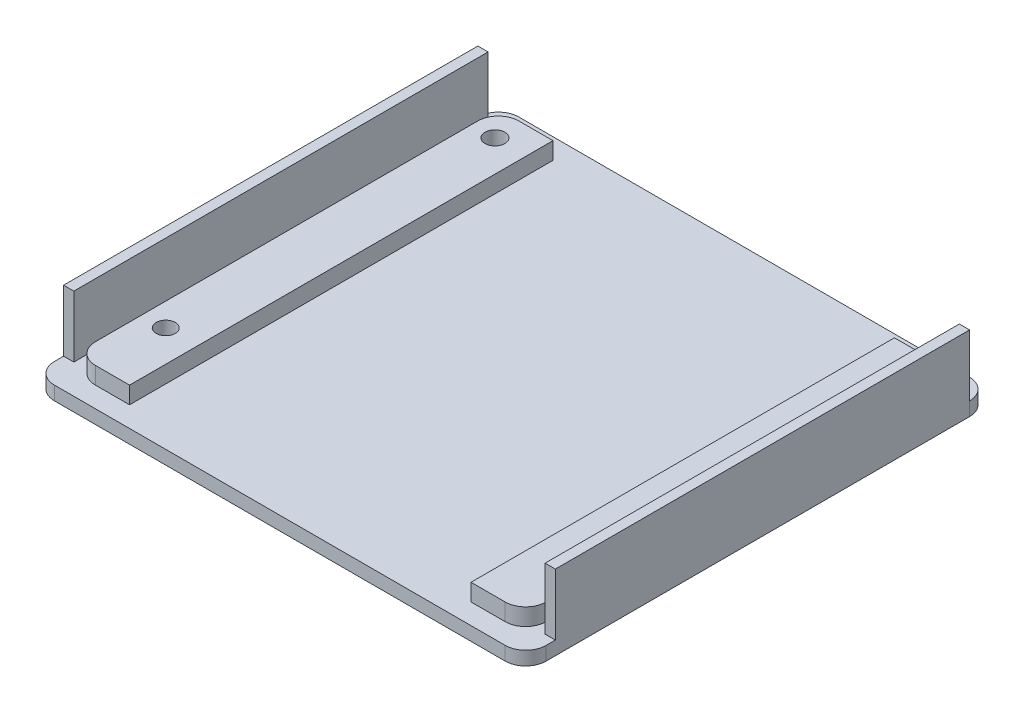
ISO-10303-21;
HEADER;
FILE_DESCRIPTION(('STEP AP214'),'2;1');
FILE_NAME('part.step','',(''),(''),'','','');
FILE_SCHEMA(('AUTOMOTIVE_DESIGN { 1 0 10303 214 1 1 1 1 }'));
ENDSEC;
DATA;
#1=APPLICATION_CONTEXT('core data for automotive mechanical design processes');
#2=APPLICATION_PROTOCOL_DEFINITION('international standard','automotive_design',2000,#1);
#3=PRODUCT_CONTEXT('',#1,'mechanical');
#4=PRODUCT('Part','Part','',(#3));
#5=PRODUCT_RELATED_PRODUCT_CATEGORY('part','',(#4));
#6=PRODUCT_DEFINITION_FORMATION('','',#4);
#7=PRODUCT_DEFINITION_CONTEXT('part definition',#1,'design');
#8=PRODUCT_DEFINITION('design','',#6,#7);
#9=PRODUCT_DEFINITION_SHAPE('','',#8);
#10=(LENGTH_UNIT() NAMED_UNIT(*) SI_UNIT(.MILLI.,.METRE.));
#11=(NAMED_UNIT(*) PLANE_ANGLE_UNIT() SI_UNIT($,.RADIAN.));
#12=(NAMED_UNIT(*) SI_UNIT($,.STERADIAN.) SOLID_ANGLE_UNIT());
#13=UNCERTAINTY_MEASURE_WITH_UNIT(LENGTH_MEASURE(1.E-05),#10,'distance_accuracy_value','');
#14=(GEOMETRIC_REPRESENTATION_CONTEXT(3) GLOBAL_UNCERTAINTY_ASSIGNED_CONTEXT((#13)) GLOBAL_UNIT_ASSIGNED_CONTEXT((#10,
#11,#12)) REPRESENTATION_CONTEXT('',''));
#15=CARTESIAN_POINT('',(0.,0.,0.));
#16=DIRECTION('',(0.,0.,1.));
#17=DIRECTION('',(1.,0.,0.));
#18=AXIS2_PLACEMENT_3D('',#15,#16,#17);
#19=CARTESIAN_POINT('',(-33.,2.,31.));
#20=DIRECTION('',(0.,1.,0.));
#21=DIRECTION('',(0.,0.,1.));
#22=AXIS2_PLACEMENT_3D('',#19,#20,#21);
#23=PLANE('',#22);
#24=DIRECTION('',(0.,0.,-1.));
#25=VECTOR('',#24,1.);
#26=CARTESIAN_POINT('',(33.,2.,-28.));
#27=LINE('',#26,#25);
#28=CARTESIAN_POINT('',(33.,2.,28.));
#29=VERTEX_POINT('',#28);
#30=CARTESIAN_POINT('',(33.,2.,-28.));
#31=VERTEX_POINT('',#30);
#32=EDGE_CURVE('E248',#29,#31,#27,.T.);
#33=ORIENTED_EDGE('',*,*,#32,.F.);
#34=CARTESIAN_POINT('',(30.,2.,28.));
#35=DIRECTION('',(0.,1.,0.));
#36=DIRECTION('',(0.,0.,-1.));
#37=AXIS2_PLACEMENT_3D('',#34,#35,#36);
#38=CIRCLE('',#37,3.);
#39=CARTESIAN_POINT('',(30.,2.,31.));
#40=VERTEX_POINT('',#39);
#41=EDGE_CURVE('E240',#40,#29,#38,.T.);
#42=ORIENTED_EDGE('',*,*,#41,.F.);
#43=DIRECTION('',(1.,0.,0.));
#44=VECTOR('',#43,1.);
#45=CARTESIAN_POINT('',(30.,2.,31.));
#46=LINE('',#45,#44);
#47=CARTESIAN_POINT('',(25.,2.,31.));
#48=VERTEX_POINT('',#47);
#49=EDGE_CURVE('E224',#48,#40,#46,.T.);
#50=ORIENTED_EDGE('',*,*,#49,.F.);
#51=DIRECTION('',(0.,0.,1.));
#52=VECTOR('',#51,1.);
#53=CARTESIAN_POINT('',(25.,2.,-31.));
#54=LINE('',#53,#52);
#55=CARTESIAN_POINT('',(25.,2.,-31.));
#56=VERTEX_POINT('',#55);
#57=EDGE_CURVE('E233',#56,#48,#54,.T.);
#58=ORIENTED_EDGE('',*,*,#57,.F.);
#59=DIRECTION('',(-1.,0.,0.));
#60=VECTOR('',#59,1.);
#61=CARTESIAN_POINT('',(30.,2.,-31.));
#62=LINE('',#61,#60);
#63=CARTESIAN_POINT('',(30.,2.,-31.));
#64=VERTEX_POINT('',#63);
#65=EDGE_CURVE('E1008',#64,#56,#62,.T.);
#66=ORIENTED_EDGE('',*,*,#65,.F.);
#67=CARTESIAN_POINT('',(30.,2.,-28.));
#68=DIRECTION('',(0.,1.,0.));
#69=DIRECTION('',(0.,0.,-1.));
#70=AXIS2_PLACEMENT_3D('',#67,#68,#69);
#71=CIRCLE('',#70,3.);
#72=EDGE_CURVE('E257',#31,#64,#71,.T.);
#73=ORIENTED_EDGE('',*,*,#72,.F.);
#74=EDGE_LOOP('',(#33,#42,#50,#58,#66,#73));
#75=FACE_BOUND('',#74,.T.);
#76=DIRECTION('',(-1.,0.,0.));
#77=VECTOR('',#76,1.);
#78=CARTESIAN_POINT('',(-30.,2.,-31.));
#79=LINE('',#78,#77);
#80=CARTESIAN_POINT('',(-25.,2.,-31.));
#81=VERTEX_POINT('',#80);
#82=CARTESIAN_POINT('',(-30.,2.,-31.));
#83=VERTEX_POINT('',#82);
#84=EDGE_CURVE('E313',#81,#83,#79,.T.);
#85=ORIENTED_EDGE('',*,*,#84,.F.);
#86=DIRECTION('',(0.,0.,-1.));
#87=VECTOR('',#86,1.);
#88=CARTESIAN_POINT('',(-25.,2.,-31.));
#89=LINE('',#88,#87);
#90=CARTESIAN_POINT('',(-25.,2.,31.));
#91=VERTEX_POINT('',#90);
#92=EDGE_CURVE('E288',#91,#81,#89,.T.);
#93=ORIENTED_EDGE('',*,*,#92,.F.);
#94=DIRECTION('',(1.,0.,0.));
#95=VECTOR('',#94,1.);
#96=CARTESIAN_POINT('',(-30.,2.,31.));
#97=LINE('',#96,#95);
#98=CARTESIAN_POINT('',(-30.,2.,31.));
#99=VERTEX_POINT('',#98);
#100=EDGE_CURVE('E294',#99,#91,#97,.T.);
#101=ORIENTED_EDGE('',*,*,#100,.F.);
#102=CARTESIAN_POINT('',(-30.,2.,28.));
#103=DIRECTION('',(0.,1.,0.));
#104=DIRECTION('',(0.,0.,1.));
#105=AXIS2_PLACEMENT_3D('',#102,#103,#104);
#106=CIRCLE('',#105,3.);
#107=CARTESIAN_POINT('',(-33.,2.,28.));
#108=VERTEX_POINT('',#107);
#109=EDGE_CURVE('E322',#108,#99,#106,.T.);
#110=ORIENTED_EDGE('',*,*,#109,.F.);
#111=DIRECTION('',(0.,0.,1.));
#112=VECTOR('',#111,1.);
#113=CARTESIAN_POINT('',(-33.,2.,-28.));
#114=LINE('',#113,#112);
#115=CARTESIAN_POINT('',(-33.,2.,-28.));
#116=VERTEX_POINT('',#115);
#117=EDGE_CURVE('E319',#116,#108,#114,.T.);
#118=ORIENTED_EDGE('',*,*,#117,.F.);
#119=CARTESIAN_POINT('',(-30.,2.,-28.));
#120=DIRECTION('',(0.,1.,0.));
#121=DIRECTION('',(0.,0.,1.));
#122=AXIS2_PLACEMENT_3D('',#119,#120,#121);
#123=CIRCLE('',#122,3.);
#124=EDGE_CURVE('E316',#83,#116,#123,.T.);
#125=ORIENTED_EDGE('',*,*,#124,.F.);
#126=EDGE_LOOP('',(#85,#93,#101,#110,#118,#125));
#127=FACE_BOUND('',#126,.T.);
#128=DIRECTION('',(0.,0.,1.));
#129=VECTOR('',#128,1.);
#130=CARTESIAN_POINT('',(34.5,2.,-31.));
#131=LINE('',#130,#129);
#132=CARTESIAN_POINT('',(34.5,2.,-31.));
#133=VERTEX_POINT('',#132);
#134=CARTESIAN_POINT('',(34.5,2.,29.6598329980831));
#135=VERTEX_POINT('',#134);
#136=EDGE_CURVE('E365',#133,#135,#131,.T.);
#137=ORIENTED_EDGE('',*,*,#136,.F.);
#138=DIRECTION('',(-1.,0.,0.));
#139=VECTOR('',#138,1.);
#140=CARTESIAN_POINT('',(36.,2.,-31.));
#141=LINE('',#140,#139);
#142=CARTESIAN_POINT('',(36.,2.,-31.));
#143=VERTEX_POINT('',#142);
#144=EDGE_CURVE('E370',#143,#133,#141,.T.);
#145=ORIENTED_EDGE('',*,*,#144,.F.);
#146=CARTESIAN_POINT('',(33.,2.,-31.));
#147=DIRECTION('',(0.,1.,0.));
#148=DIRECTION('',(0.,0.,-1.));
#149=AXIS2_PLACEMENT_3D('',#146,#147,#148);
#150=CIRCLE('',#149,3.);
#151=CARTESIAN_POINT('',(33.,2.,-34.));
#152=VERTEX_POINT('',#151);
#153=EDGE_CURVE('E441',#143,#152,#150,.T.);
#154=ORIENTED_EDGE('',*,*,#153,.T.);
#155=DIRECTION('',(-1.,0.,0.));
#156=VECTOR('',#155,1.);
#157=CARTESIAN_POINT('',(-33.,2.,-34.));
#158=LINE('',#157,#156);
#159=CARTESIAN_POINT('',(-33.,2.,-34.));
#160=VERTEX_POINT('',#159);
#161=EDGE_CURVE('E444',#152,#160,#158,.T.);
#162=ORIENTED_EDGE('',*,*,#161,.T.);
#163=CARTESIAN_POINT('',(-33.,2.,-31.));
#164=DIRECTION('',(0.,1.,0.));
#165=DIRECTION('',(0.,0.,1.));
#166=AXIS2_PLACEMENT_3D('',#163,#164,#165);
#167=CIRCLE('',#166,3.00000000000001);
#168=CARTESIAN_POINT('',(-36.,2.,-31.));
#169=VERTEX_POINT('',#168);
#170=EDGE_CURVE('E447',#160,#169,#167,.T.);
#171=ORIENTED_EDGE('',*,*,#170,.T.);
#172=DIRECTION('',(-1.,0.,0.));
#173=VECTOR('',#172,1.);
#174=CARTESIAN_POINT('',(-36.,2.,-31.));
#175=LINE('',#174,#173);
#176=CARTESIAN_POINT('',(-34.5,2.,-31.));
#177=VERTEX_POINT('',#176);
#178=EDGE_CURVE('E390',#177,#169,#175,.T.);
#179=ORIENTED_EDGE('',*,*,#178,.F.);
#180=DIRECTION('',(0.,0.,-1.));
#181=VECTOR('',#180,1.);
#182=CARTESIAN_POINT('',(-34.5,2.,-31.));
#183=LINE('',#182,#181);
#184=CARTESIAN_POINT('',(-34.5,2.,29.6598329980831));
#185=VERTEX_POINT('',#184);
#186=EDGE_CURVE('E403',#185,#177,#183,.T.);
#187=ORIENTED_EDGE('',*,*,#186,.F.);
#188=DIRECTION('',(1.,0.,0.));
#189=VECTOR('',#188,1.);
#190=CARTESIAN_POINT('',(-36.,2.,29.6598329980831));
#191=LINE('',#190,#189);
#192=CARTESIAN_POINT('',(-36.,2.,29.6598329980831));
#193=VERTEX_POINT('',#192);
#194=EDGE_CURVE('E373',#193,#185,#191,.T.);
#195=ORIENTED_EDGE('',*,*,#194,.F.);
#196=DIRECTION('',(0.,0.,1.));
#197=VECTOR('',#196,1.);
#198=CARTESIAN_POINT('',(-36.,2.,-31.));
#199=LINE('',#198,#197);
#200=CARTESIAN_POINT('',(-36.,2.,31.));
#201=VERTEX_POINT('',#200);
#202=EDGE_CURVE('E450',#193,#201,#199,.T.);
#203=ORIENTED_EDGE('',*,*,#202,.T.);
#204=CARTESIAN_POINT('',(-33.,2.,31.));
#205=DIRECTION('',(0.,1.,0.));
#206=DIRECTION('',(0.,0.,1.));
#207=AXIS2_PLACEMENT_3D('',#204,#205,#206);
#208=CIRCLE('',#207,2.99999999999999);
#209=CARTESIAN_POINT('',(-33.,2.,34.));
#210=VERTEX_POINT('',#209);
#211=EDGE_CURVE('E426',#201,#210,#208,.T.);
#212=ORIENTED_EDGE('',*,*,#211,.T.);
#213=DIRECTION('',(1.,0.,0.));
#214=VECTOR('',#213,1.);
#215=CARTESIAN_POINT('',(-33.,2.,34.));
#216=LINE('',#215,#214);
#217=CARTESIAN_POINT('',(33.,2.,34.));
#218=VERTEX_POINT('',#217);
#219=EDGE_CURVE('E430',#210,#218,#216,.T.);
#220=ORIENTED_EDGE('',*,*,#219,.T.);
#221=CARTESIAN_POINT('',(33.,2.,31.));
#222=DIRECTION('',(0.,1.,0.));
#223=DIRECTION('',(0.,0.,1.));
#224=AXIS2_PLACEMENT_3D('',#221,#222,#223);
#225=CIRCLE('',#224,3.);
#226=CARTESIAN_POINT('',(36.,2.,31.));
#227=VERTEX_POINT('',#226);
#228=EDGE_CURVE('E434',#218,#227,#225,.T.);
#229=ORIENTED_EDGE('',*,*,#228,.T.);
#230=DIRECTION('',(0.,0.,-1.));
#231=VECTOR('',#230,1.);
#232=CARTESIAN_POINT('',(36.,2.,-31.));
#233=LINE('',#232,#231);
#234=CARTESIAN_POINT('',(36.,2.,29.6598329980831));
#235=VERTEX_POINT('',#234);
#236=EDGE_CURVE('E437',#227,#235,#233,.T.);
#237=ORIENTED_EDGE('',*,*,#236,.T.);
#238=DIRECTION('',(1.,0.,0.));
#239=VECTOR('',#238,1.);
#240=CARTESIAN_POINT('',(36.,2.,29.6598329980831));
#241=LINE('',#240,#239);
#242=EDGE_CURVE('E362',#135,#235,#241,.T.);
#243=ORIENTED_EDGE('',*,*,#242,.F.);
#244=EDGE_LOOP('',(#137,#145,#154,#162,#171,#179,#187,#195,#203,#212,#220,#229,#237,#243));
#245=FACE_BOUND('',#244,.T.);
#246=ADVANCED_FACE('F43',(#75,#127,#245),#23,.T.);
#247=CARTESIAN_POINT('',(-33.,2.,31.));
#248=DIRECTION('',(0.,-1.,0.));
#249=DIRECTION('',(0.,0.,-1.));
#250=AXIS2_PLACEMENT_3D('',#247,#248,#249);
#251=CYLINDRICAL_SURFACE('',#250,2.99999999999999);
#252=CARTESIAN_POINT('',(-33.,0.,31.));
#253=DIRECTION('',(0.,1.,0.));
#254=DIRECTION('',(0.,0.,1.));
#255=AXIS2_PLACEMENT_3D('',#252,#253,#254);
#256=CIRCLE('',#255,2.99999999999999);
#257=CARTESIAN_POINT('',(-36.,0.,31.));
#258=VERTEX_POINT('',#257);
#259=CARTESIAN_POINT('',(-33.,0.,34.));
#260=VERTEX_POINT('',#259);
#261=EDGE_CURVE('E425',#258,#260,#256,.T.);
#262=ORIENTED_EDGE('',*,*,#261,.T.);
#263=DIRECTION('',(0.,-1.,0.));
#264=VECTOR('',#263,1.);
#265=CARTESIAN_POINT('',(-33.,2.,34.));
#266=LINE('',#265,#264);
#267=EDGE_CURVE('E504',#210,#260,#266,.T.);
#268=ORIENTED_EDGE('',*,*,#267,.F.);
#269=ORIENTED_EDGE('',*,*,#211,.F.);
#270=DIRECTION('',(0.,-1.,0.));
#271=VECTOR('',#270,1.);
#272=CARTESIAN_POINT('',(-36.,2.,31.));
#273=LINE('',#272,#271);
#274=EDGE_CURVE('E453',#201,#258,#273,.T.);
#275=ORIENTED_EDGE('',*,*,#274,.T.);
#276=EDGE_LOOP('',(#262,#268,#269,#275));
#277=FACE_BOUND('',#276,.T.);
#278=ADVANCED_FACE('F45',(#277),#251,.T.);
#279=CARTESIAN_POINT('',(-33.,2.,34.));
#280=DIRECTION('',(0.,0.,-1.));
#281=DIRECTION('',(-1.,0.,0.));
#282=AXIS2_PLACEMENT_3D('',#279,#280,#281);
#283=PLANE('',#282);
#284=DIRECTION('',(1.,0.,0.));
#285=VECTOR('',#284,1.);
#286=CARTESIAN_POINT('',(-33.,0.,34.));
#287=LINE('',#286,#285);
#288=CARTESIAN_POINT('',(33.,0.,34.));
#289=VERTEX_POINT('',#288);
#290=EDGE_CURVE('E457',#260,#289,#287,.T.);
#291=ORIENTED_EDGE('',*,*,#290,.T.);
#292=DIRECTION('',(0.,-1.,0.));
#293=VECTOR('',#292,1.);
#294=CARTESIAN_POINT('',(33.,2.,34.));
#295=LINE('',#294,#293);
#296=EDGE_CURVE('E500',#218,#289,#295,.T.);
#297=ORIENTED_EDGE('',*,*,#296,.F.);
#298=ORIENTED_EDGE('',*,*,#219,.F.);
#299=ORIENTED_EDGE('',*,*,#267,.T.);
#300=EDGE_LOOP('',(#291,#297,#298,#299));
#301=FACE_BOUND('',#300,.T.);
#302=ADVANCED_FACE('F544',(#301),#283,.F.);
#303=CARTESIAN_POINT('',(33.,2.,31.));
#304=DIRECTION('',(0.,-1.,0.));
#305=DIRECTION('',(0.,0.,-1.));
#306=AXIS2_PLACEMENT_3D('',#303,#304,#305);
#307=CYLINDRICAL_SURFACE('',#306,3.);
#308=CARTESIAN_POINT('',(33.,0.,31.));
#309=DIRECTION('',(0.,1.,0.));
#310=DIRECTION('',(0.,0.,1.));
#311=AXIS2_PLACEMENT_3D('',#308,#309,#310);
#312=CIRCLE('',#311,3.);
#313=CARTESIAN_POINT('',(36.,0.,31.));
#314=VERTEX_POINT('',#313);
#315=EDGE_CURVE('E460',#289,#314,#312,.T.);
#316=ORIENTED_EDGE('',*,*,#315,.T.);
#317=DIRECTION('',(0.,-1.,0.));
#318=VECTOR('',#317,1.);
#319=CARTESIAN_POINT('',(36.,2.,31.));
#320=LINE('',#319,#318);
#321=EDGE_CURVE('E496',#227,#314,#320,.T.);
#322=ORIENTED_EDGE('',*,*,#321,.F.);
#323=ORIENTED_EDGE('',*,*,#228,.F.);
#324=ORIENTED_EDGE('',*,*,#296,.T.);
#325=EDGE_LOOP('',(#316,#322,#323,#324));
#326=FACE_BOUND('',#325,.T.);
#327=ADVANCED_FACE('F648',(#326),#307,.T.);
#328=CARTESIAN_POINT('',(36.,2.,-31.));
#329=DIRECTION('',(-1.,0.,0.));
#330=DIRECTION('',(0.,0.,1.));
#331=AXIS2_PLACEMENT_3D('',#328,#329,#330);
#332=PLANE('',#331);
#333=DIRECTION('',(0.,0.,-1.));
#334=VECTOR('',#333,1.);
#335=CARTESIAN_POINT('',(36.,0.,-31.));
#336=LINE('',#335,#334);
#337=CARTESIAN_POINT('',(36.,0.,-31.));
#338=VERTEX_POINT('',#337);
#339=EDGE_CURVE('E463',#314,#338,#336,.T.);
#340=ORIENTED_EDGE('',*,*,#339,.T.);
#341=DIRECTION('',(0.,-1.,0.));
#342=VECTOR('',#341,1.);
#343=CARTESIAN_POINT('',(36.,2.,-31.));
#344=LINE('',#343,#342);
#345=EDGE_CURVE('E492',#143,#338,#344,.T.);
#346=ORIENTED_EDGE('',*,*,#345,.F.);
#347=DIRECTION('',(0.,-1.,0.));
#348=VECTOR('',#347,1.);
#349=CARTESIAN_POINT('',(36.,11.,-31.));
#350=LINE('',#349,#348);
#351=CARTESIAN_POINT('',(36.,11.,-31.));
#352=VERTEX_POINT('',#351);
#353=EDGE_CURVE('E347',#352,#143,#350,.T.);
#354=ORIENTED_EDGE('',*,*,#353,.F.);
#355=DIRECTION('',(0.,0.,-1.));
#356=VECTOR('',#355,1.);
#357=CARTESIAN_POINT('',(36.,11.,-31.));
#358=LINE('',#357,#356);
#359=CARTESIAN_POINT('',(36.,11.,29.6598329980831));
#360=VERTEX_POINT('',#359);
#361=EDGE_CURVE('E366',#360,#352,#358,.T.);
#362=ORIENTED_EDGE('',*,*,#361,.F.);
#363=DIRECTION('',(0.,-1.,0.));
#364=VECTOR('',#363,1.);
#365=CARTESIAN_POINT('',(36.,11.,29.6598329980831));
#366=LINE('',#365,#364);
#367=EDGE_CURVE('E357',#360,#235,#366,.T.);
#368=ORIENTED_EDGE('',*,*,#367,.T.);
#369=ORIENTED_EDGE('',*,*,#236,.F.);
#370=ORIENTED_EDGE('',*,*,#321,.T.);
#371=EDGE_LOOP('',(#340,#346,#354,#362,#368,#369,#370));
#372=FACE_BOUND('',#371,.T.);
#373=ADVANCED_FACE('F652',(#372),#332,.F.);
#374=CARTESIAN_POINT('',(33.,2.,-31.));
#375=DIRECTION('',(0.,-1.,0.));
#376=DIRECTION('',(0.,0.,-1.));
#377=AXIS2_PLACEMENT_3D('',#374,#375,#376);
#378=CYLINDRICAL_SURFACE('',#377,3.);
#379=CARTESIAN_POINT('',(33.,0.,-31.));
#380=DIRECTION('',(0.,1.,0.));
#381=DIRECTION('',(0.,0.,-1.));
#382=AXIS2_PLACEMENT_3D('',#379,#380,#381);
#383=CIRCLE('',#382,3.);
#384=CARTESIAN_POINT('',(33.,0.,-34.));
#385=VERTEX_POINT('',#384);
#386=EDGE_CURVE('E466',#338,#385,#383,.T.);
#387=ORIENTED_EDGE('',*,*,#386,.T.);
#388=DIRECTION('',(0.,-1.,0.));
#389=VECTOR('',#388,1.);
#390=CARTESIAN_POINT('',(33.,2.,-34.));
#391=LINE('',#390,#389);
#392=EDGE_CURVE('E488',#152,#385,#391,.T.);
#393=ORIENTED_EDGE('',*,*,#392,.F.);
#394=ORIENTED_EDGE('',*,*,#153,.F.);
#395=ORIENTED_EDGE('',*,*,#345,.T.);
#396=EDGE_LOOP('',(#387,#393,#394,#395));
#397=FACE_BOUND('',#396,.T.);
#398=ADVANCED_FACE('F667',(#397),#378,.T.);
#399=CARTESIAN_POINT('',(-33.,2.,-34.));
#400=DIRECTION('',(0.,0.,1.));
#401=DIRECTION('',(1.,0.,0.));
#402=AXIS2_PLACEMENT_3D('',#399,#400,#401);
#403=PLANE('',#402);
#404=DIRECTION('',(-1.,0.,0.));
#405=VECTOR('',#404,1.);
#406=CARTESIAN_POINT('',(-33.,0.,-34.));
#407=LINE('',#406,#405);
#408=CARTESIAN_POINT('',(-33.,0.,-34.));
#409=VERTEX_POINT('',#408);
#410=EDGE_CURVE('E469',#385,#409,#407,.T.);
#411=ORIENTED_EDGE('',*,*,#410,.T.);
#412=DIRECTION('',(0.,-1.,0.));
#413=VECTOR('',#412,1.);
#414=CARTESIAN_POINT('',(-33.,2.,-34.));
#415=LINE('',#414,#413);
#416=EDGE_CURVE('E484',#160,#409,#415,.T.);
#417=ORIENTED_EDGE('',*,*,#416,.F.);
#418=ORIENTED_EDGE('',*,*,#161,.F.);
#419=ORIENTED_EDGE('',*,*,#392,.T.);
#420=EDGE_LOOP('',(#411,#417,#418,#419));
#421=FACE_BOUND('',#420,.T.);
#422=ADVANCED_FACE('F672',(#421),#403,.F.);
#423=CARTESIAN_POINT('',(-33.,2.,-31.));
#424=DIRECTION('',(0.,-1.,0.));
#425=DIRECTION('',(0.,0.,-1.));
#426=AXIS2_PLACEMENT_3D('',#423,#424,#425);
#427=CYLINDRICAL_SURFACE('',#426,3.00000000000001);
#428=CARTESIAN_POINT('',(-33.,0.,-31.));
#429=DIRECTION('',(0.,1.,0.));
#430=DIRECTION('',(0.,0.,1.));
#431=AXIS2_PLACEMENT_3D('',#428,#429,#430);
#432=CIRCLE('',#431,3.00000000000001);
#433=CARTESIAN_POINT('',(-36.,0.,-31.));
#434=VERTEX_POINT('',#433);
#435=EDGE_CURVE('E472',#409,#434,#432,.T.);
#436=ORIENTED_EDGE('',*,*,#435,.T.);
#437=DIRECTION('',(0.,-1.,0.));
#438=VECTOR('',#437,1.);
#439=CARTESIAN_POINT('',(-36.,2.,-31.));
#440=LINE('',#439,#438);
#441=EDGE_CURVE('E480',#169,#434,#440,.T.);
#442=ORIENTED_EDGE('',*,*,#441,.F.);
#443=ORIENTED_EDGE('',*,*,#170,.F.);
#444=ORIENTED_EDGE('',*,*,#416,.T.);
#445=EDGE_LOOP('',(#436,#442,#443,#444));
#446=FACE_BOUND('',#445,.T.);
#447=ADVANCED_FACE('F676',(#446),#427,.T.);
#448=CARTESIAN_POINT('',(-36.,2.,-31.));
#449=DIRECTION('',(1.,0.,0.));
#450=DIRECTION('',(0.,0.,-1.));
#451=AXIS2_PLACEMENT_3D('',#448,#449,#450);
#452=PLANE('',#451);
#453=DIRECTION('',(0.,0.,1.));
#454=VECTOR('',#453,1.);
#455=CARTESIAN_POINT('',(-36.,0.,-31.));
#456=LINE('',#455,#454);
#457=EDGE_CURVE('E431',#434,#258,#456,.T.);
#458=ORIENTED_EDGE('',*,*,#457,.T.);
#459=ORIENTED_EDGE('',*,*,#274,.F.);
#460=ORIENTED_EDGE('',*,*,#202,.F.);
#461=DIRECTION('',(0.,-1.,0.));
#462=VECTOR('',#461,1.);
#463=CARTESIAN_POINT('',(-36.,11.,29.6598329980831));
#464=LINE('',#463,#462);
#465=CARTESIAN_POINT('',(-36.,11.,29.6598329980831));
#466=VERTEX_POINT('',#465);
#467=EDGE_CURVE('E421',#466,#193,#464,.T.);
#468=ORIENTED_EDGE('',*,*,#467,.F.);
#469=DIRECTION('',(0.,0.,1.));
#470=VECTOR('',#469,1.);
#471=CARTESIAN_POINT('',(-36.,11.,-31.));
#472=LINE('',#471,#470);
#473=CARTESIAN_POINT('',(-36.,11.,-31.));
#474=VERTEX_POINT('',#473);
#475=EDGE_CURVE('E385',#474,#466,#472,.T.);
#476=ORIENTED_EDGE('',*,*,#475,.F.);
#477=DIRECTION('',(0.,-1.,0.));
#478=VECTOR('',#477,1.);
#479=CARTESIAN_POINT('',(-36.,11.,-31.));
#480=LINE('',#479,#478);
#481=EDGE_CURVE('E399',#474,#169,#480,.T.);
#482=ORIENTED_EDGE('',*,*,#481,.T.);
#483=ORIENTED_EDGE('',*,*,#441,.T.);
#484=EDGE_LOOP('',(#458,#459,#460,#468,#476,#482,#483));
#485=FACE_BOUND('',#484,.T.);
#486=ADVANCED_FACE('F625',(#485),#452,.F.);
#487=CARTESIAN_POINT('',(-33.,0.,31.));
#488=DIRECTION('',(0.,1.,0.));
#489=DIRECTION('',(0.,0.,1.));
#490=AXIS2_PLACEMENT_3D('',#487,#488,#489);
#491=PLANE('',#490);
#492=ORIENTED_EDGE('',*,*,#261,.F.);
#493=ORIENTED_EDGE('',*,*,#457,.F.);
#494=ORIENTED_EDGE('',*,*,#435,.F.);
#495=ORIENTED_EDGE('',*,*,#410,.F.);
#496=ORIENTED_EDGE('',*,*,#386,.F.);
#497=ORIENTED_EDGE('',*,*,#339,.F.);
#498=ORIENTED_EDGE('',*,*,#315,.F.);
#499=ORIENTED_EDGE('',*,*,#290,.F.);
#500=EDGE_LOOP('',(#492,#493,#494,#495,#496,#497,#498,#499));
#501=FACE_BOUND('',#500,.T.);
#502=ADVANCED_FACE('F620',(#501),#491,.F.);
#503=CARTESIAN_POINT('',(-36.,11.,29.6598329980831));
#504=DIRECTION('',(0.,0.,-1.));
#505=DIRECTION('',(-1.,0.,0.));
#506=AXIS2_PLACEMENT_3D('',#503,#504,#505);
#507=PLANE('',#506);
#508=ORIENTED_EDGE('',*,*,#194,.T.);
#509=DIRECTION('',(0.,-1.,0.));
#510=VECTOR('',#509,1.);
#511=CARTESIAN_POINT('',(-34.5,11.,29.6598329980831));
#512=LINE('',#511,#510);
#513=CARTESIAN_POINT('',(-34.5,11.,29.6598329980831));
#514=VERTEX_POINT('',#513);
#515=EDGE_CURVE('E417',#514,#185,#512,.T.);
#516=ORIENTED_EDGE('',*,*,#515,.F.);
#517=DIRECTION('',(1.,0.,0.));
#518=VECTOR('',#517,1.);
#519=CARTESIAN_POINT('',(-36.,11.,29.6598329980831));
#520=LINE('',#519,#518);
#521=EDGE_CURVE('E389',#466,#514,#520,.T.);
#522=ORIENTED_EDGE('',*,*,#521,.F.);
#523=ORIENTED_EDGE('',*,*,#467,.T.);
#524=EDGE_LOOP('',(#508,#516,#522,#523));
#525=FACE_BOUND('',#524,.T.);
#526=ADVANCED_FACE('F617',(#525),#507,.F.);
#527=CARTESIAN_POINT('',(-34.5,11.,-31.));
#528=DIRECTION('',(-1.,0.,0.));
#529=DIRECTION('',(0.,0.,1.));
#530=AXIS2_PLACEMENT_3D('',#527,#528,#529);
#531=PLANE('',#530);
#532=ORIENTED_EDGE('',*,*,#186,.T.);
#533=DIRECTION('',(0.,-1.,0.));
#534=VECTOR('',#533,1.);
#535=CARTESIAN_POINT('',(-34.5,11.,-31.));
#536=LINE('',#535,#534);
#537=CARTESIAN_POINT('',(-34.5,11.,-31.));
#538=VERTEX_POINT('',#537);
#539=EDGE_CURVE('E413',#538,#177,#536,.T.);
#540=ORIENTED_EDGE('',*,*,#539,.F.);
#541=DIRECTION('',(0.,0.,-1.));
#542=VECTOR('',#541,1.);
#543=CARTESIAN_POINT('',(-34.5,11.,-31.));
#544=LINE('',#543,#542);
#545=EDGE_CURVE('E393',#514,#538,#544,.T.);
#546=ORIENTED_EDGE('',*,*,#545,.F.);
#547=ORIENTED_EDGE('',*,*,#515,.T.);
#548=EDGE_LOOP('',(#532,#540,#546,#547));
#549=FACE_BOUND('',#548,.T.);
#550=ADVANCED_FACE('F614',(#549),#531,.F.);
#551=CARTESIAN_POINT('',(-36.,11.,-31.));
#552=DIRECTION('',(0.,0.,1.));
#553=DIRECTION('',(1.,0.,0.));
#554=AXIS2_PLACEMENT_3D('',#551,#552,#553);
#555=PLANE('',#554);
#556=ORIENTED_EDGE('',*,*,#178,.T.);
#557=ORIENTED_EDGE('',*,*,#481,.F.);
#558=DIRECTION('',(-1.,0.,0.));
#559=VECTOR('',#558,1.);
#560=CARTESIAN_POINT('',(-36.,11.,-31.));
#561=LINE('',#560,#559);
#562=EDGE_CURVE('E396',#538,#474,#561,.T.);
#563=ORIENTED_EDGE('',*,*,#562,.F.);
#564=ORIENTED_EDGE('',*,*,#539,.T.);
#565=EDGE_LOOP('',(#556,#557,#563,#564));
#566=FACE_BOUND('',#565,.T.);
#567=ADVANCED_FACE('F610',(#566),#555,.F.);
#568=CARTESIAN_POINT('',(0.,11.,0.));
#569=DIRECTION('',(0.,1.,0.));
#570=DIRECTION('',(0.,0.,1.));
#571=AXIS2_PLACEMENT_3D('',#568,#569,#570);
#572=PLANE('',#571);
#573=ORIENTED_EDGE('',*,*,#475,.T.);
#574=ORIENTED_EDGE('',*,*,#521,.T.);
#575=ORIENTED_EDGE('',*,*,#545,.T.);
#576=ORIENTED_EDGE('',*,*,#562,.T.);
#577=EDGE_LOOP('',(#573,#574,#575,#576));
#578=FACE_BOUND('',#577,.T.);
#579=ADVANCED_FACE('F596',(#578),#572,.T.);
#580=CARTESIAN_POINT('',(36.,11.,-31.));
#581=DIRECTION('',(0.,0.,1.));
#582=DIRECTION('',(1.,0.,0.));
#583=AXIS2_PLACEMENT_3D('',#580,#581,#582);
#584=PLANE('',#583);
#585=ORIENTED_EDGE('',*,*,#144,.T.);
#586=DIRECTION('',(0.,-1.,0.));
#587=VECTOR('',#586,1.);
#588=CARTESIAN_POINT('',(34.5,11.,-31.));
#589=LINE('',#588,#587);
#590=CARTESIAN_POINT('',(34.5,11.,-31.));
#591=VERTEX_POINT('',#590);
#592=EDGE_CURVE('E350',#591,#133,#589,.T.);
#593=ORIENTED_EDGE('',*,*,#592,.F.);
#594=DIRECTION('',(-1.,0.,0.));
#595=VECTOR('',#594,1.);
#596=CARTESIAN_POINT('',(36.,11.,-31.));
#597=LINE('',#596,#595);
#598=EDGE_CURVE('E379',#352,#591,#597,.T.);
#599=ORIENTED_EDGE('',*,*,#598,.F.);
#600=ORIENTED_EDGE('',*,*,#353,.T.);
#601=EDGE_LOOP('',(#585,#593,#599,#600));
#602=FACE_BOUND('',#601,.T.);
#603=ADVANCED_FACE('F592',(#602),#584,.F.);
#604=CARTESIAN_POINT('',(34.5,11.,-31.));
#605=DIRECTION('',(1.,0.,0.));
#606=DIRECTION('',(0.,0.,-1.));
#607=AXIS2_PLACEMENT_3D('',#604,#605,#606);
#608=PLANE('',#607);
#609=ORIENTED_EDGE('',*,*,#136,.T.);
#610=DIRECTION('',(0.,-1.,0.));
#611=VECTOR('',#610,1.);
#612=CARTESIAN_POINT('',(34.5,11.,29.6598329980831));
#613=LINE('',#612,#611);
#614=CARTESIAN_POINT('',(34.5,11.,29.6598329980831));
#615=VERTEX_POINT('',#614);
#616=EDGE_CURVE('E354',#615,#135,#613,.T.);
#617=ORIENTED_EDGE('',*,*,#616,.F.);
#618=DIRECTION('',(0.,0.,1.));
#619=VECTOR('',#618,1.);
#620=CARTESIAN_POINT('',(34.5,11.,-31.));
#621=LINE('',#620,#619);
#622=EDGE_CURVE('E376',#591,#615,#621,.T.);
#623=ORIENTED_EDGE('',*,*,#622,.F.);
#624=ORIENTED_EDGE('',*,*,#592,.T.);
#625=EDGE_LOOP('',(#609,#617,#623,#624));
#626=FACE_BOUND('',#625,.T.);
#627=ADVANCED_FACE('F595',(#626),#608,.F.);
#628=CARTESIAN_POINT('',(36.,11.,29.6598329980831));
#629=DIRECTION('',(0.,0.,-1.));
#630=DIRECTION('',(-1.,0.,0.));
#631=AXIS2_PLACEMENT_3D('',#628,#629,#630);
#632=PLANE('',#631);
#633=ORIENTED_EDGE('',*,*,#242,.T.);
#634=ORIENTED_EDGE('',*,*,#367,.F.);
#635=DIRECTION('',(1.,0.,0.));
#636=VECTOR('',#635,1.);
#637=CARTESIAN_POINT('',(36.,11.,29.6598329980831));
#638=LINE('',#637,#636);
#639=EDGE_CURVE('E361',#615,#360,#638,.T.);
#640=ORIENTED_EDGE('',*,*,#639,.F.);
#641=ORIENTED_EDGE('',*,*,#616,.T.);
#642=EDGE_LOOP('',(#633,#634,#640,#641));
#643=FACE_BOUND('',#642,.T.);
#644=ADVANCED_FACE('F600',(#643),#632,.F.);
#645=CARTESIAN_POINT('',(0.,11.,0.));
#646=DIRECTION('',(0.,-1.,0.));
#647=DIRECTION('',(0.,0.,-1.));
#648=AXIS2_PLACEMENT_3D('',#645,#646,#647);
#649=PLANE('',#648);
#650=ORIENTED_EDGE('',*,*,#361,.T.);
#651=ORIENTED_EDGE('',*,*,#598,.T.);
#652=ORIENTED_EDGE('',*,*,#622,.T.);
#653=ORIENTED_EDGE('',*,*,#639,.T.);
#654=EDGE_LOOP('',(#650,#651,#652,#653));
#655=FACE_BOUND('',#654,.T.);
#656=ADVANCED_FACE('F569',(#655),#649,.F.);
#657=CARTESIAN_POINT('',(-30.,4.5,28.));
#658=DIRECTION('',(0.,1.,0.));
#659=DIRECTION('',(0.,0.,1.));
#660=AXIS2_PLACEMENT_3D('',#657,#658,#659);
#661=PLANE('',#660);
#662=CARTESIAN_POINT('',(-29.6,4.5,-27.1));
#663=DIRECTION('',(0.,1.,0.));
#664=DIRECTION('',(0.,0.,1.));
#665=AXIS2_PLACEMENT_3D('',#662,#663,#664);
#666=CIRCLE('',#665,1.45);
#667=CARTESIAN_POINT('',(-29.6,4.5,-25.65));
#668=VERTEX_POINT('',#667);
#669=EDGE_CURVE('E284',#668,#668,#666,.T.);
#670=ORIENTED_EDGE('',*,*,#669,.F.);
#671=EDGE_LOOP('',(#670));
#672=FACE_BOUND('',#671,.T.);
#673=DIRECTION('',(0.,0.,-1.));
#674=VECTOR('',#673,1.);
#675=CARTESIAN_POINT('',(-25.,4.5,-31.));
#676=LINE('',#675,#674);
#677=CARTESIAN_POINT('',(-25.,4.5,31.));
#678=VERTEX_POINT('',#677);
#679=CARTESIAN_POINT('',(-25.,4.5,-31.));
#680=VERTEX_POINT('',#679);
#681=EDGE_CURVE('E289',#678,#680,#676,.T.);
#682=ORIENTED_EDGE('',*,*,#681,.T.);
#683=DIRECTION('',(-1.,0.,0.));
#684=VECTOR('',#683,1.);
#685=CARTESIAN_POINT('',(-30.,4.5,-31.));
#686=LINE('',#685,#684);
#687=CARTESIAN_POINT('',(-30.,4.5,-31.));
#688=VERTEX_POINT('',#687);
#689=EDGE_CURVE('E293',#680,#688,#686,.T.);
#690=ORIENTED_EDGE('',*,*,#689,.T.);
#691=CARTESIAN_POINT('',(-30.,4.5,-28.));
#692=DIRECTION('',(0.,1.,0.));
#693=DIRECTION('',(0.,0.,1.));
#694=AXIS2_PLACEMENT_3D('',#691,#692,#693);
#695=CIRCLE('',#694,3.);
#696=CARTESIAN_POINT('',(-33.,4.5,-28.));
#697=VERTEX_POINT('',#696);
#698=EDGE_CURVE('E297',#688,#697,#695,.T.);
#699=ORIENTED_EDGE('',*,*,#698,.T.);
#700=DIRECTION('',(0.,0.,1.));
#701=VECTOR('',#700,1.);
#702=CARTESIAN_POINT('',(-33.,4.5,-28.));
#703=LINE('',#702,#701);
#704=CARTESIAN_POINT('',(-33.,4.5,28.));
#705=VERTEX_POINT('',#704);
#706=EDGE_CURVE('E300',#697,#705,#703,.T.);
#707=ORIENTED_EDGE('',*,*,#706,.T.);
#708=CARTESIAN_POINT('',(-30.,4.5,28.));
#709=DIRECTION('',(0.,1.,0.));
#710=DIRECTION('',(0.,0.,1.));
#711=AXIS2_PLACEMENT_3D('',#708,#709,#710);
#712=CIRCLE('',#711,3.);
#713=CARTESIAN_POINT('',(-30.,4.5,31.));
#714=VERTEX_POINT('',#713);
#715=EDGE_CURVE('E303',#705,#714,#712,.T.);
#716=ORIENTED_EDGE('',*,*,#715,.T.);
#717=DIRECTION('',(1.,0.,0.));
#718=VECTOR('',#717,1.);
#719=CARTESIAN_POINT('',(-30.,4.5,31.));
#720=LINE('',#719,#718);
#721=EDGE_CURVE('E306',#714,#678,#720,.T.);
#722=ORIENTED_EDGE('',*,*,#721,.T.);
#723=EDGE_LOOP('',(#682,#690,#699,#707,#716,#722));
#724=FACE_BOUND('',#723,.T.);
#725=CARTESIAN_POINT('',(-29.6,4.5,21.1));
#726=DIRECTION('',(0.,1.,0.));
#727=DIRECTION('',(0.,0.,1.));
#728=AXIS2_PLACEMENT_3D('',#725,#726,#727);
#729=CIRCLE('',#728,1.4);
#730=CARTESIAN_POINT('',(-29.6,4.5,22.5));
#731=VERTEX_POINT('',#730);
#732=EDGE_CURVE('E280',#731,#731,#729,.T.);
#733=ORIENTED_EDGE('',*,*,#732,.F.);
#734=EDGE_LOOP('',(#733));
#735=FACE_BOUND('',#734,.T.);
#736=ADVANCED_FACE('F565',(#672,#724,#735),#661,.T.);
#737=CARTESIAN_POINT('',(-25.,4.5,-31.));
#738=DIRECTION('',(-1.,0.,0.));
#739=DIRECTION('',(0.,0.,1.));
#740=AXIS2_PLACEMENT_3D('',#737,#738,#739);
#741=PLANE('',#740);
#742=ORIENTED_EDGE('',*,*,#92,.T.);
#743=DIRECTION('',(0.,-1.,0.));
#744=VECTOR('',#743,1.);
#745=CARTESIAN_POINT('',(-25.,4.5,-31.));
#746=LINE('',#745,#744);
#747=EDGE_CURVE('E344',#680,#81,#746,.T.);
#748=ORIENTED_EDGE('',*,*,#747,.F.);
#749=ORIENTED_EDGE('',*,*,#681,.F.);
#750=DIRECTION('',(0.,-1.,0.));
#751=VECTOR('',#750,1.);
#752=CARTESIAN_POINT('',(-25.,4.5,31.));
#753=LINE('',#752,#751);
#754=EDGE_CURVE('E309',#678,#91,#753,.T.);
#755=ORIENTED_EDGE('',*,*,#754,.T.);
#756=EDGE_LOOP('',(#742,#748,#749,#755));
#757=FACE_BOUND('',#756,.T.);
#758=ADVANCED_FACE('F568',(#757),#741,.F.);
#759=CARTESIAN_POINT('',(-30.,4.5,-31.));
#760=DIRECTION('',(0.,0.,1.));
#761=DIRECTION('',(1.,0.,0.));
#762=AXIS2_PLACEMENT_3D('',#759,#760,#761);
#763=PLANE('',#762);
#764=ORIENTED_EDGE('',*,*,#84,.T.);
#765=DIRECTION('',(0.,-1.,0.));
#766=VECTOR('',#765,1.);
#767=CARTESIAN_POINT('',(-30.,4.5,-31.));
#768=LINE('',#767,#766);
#769=EDGE_CURVE('E340',#688,#83,#768,.T.);
#770=ORIENTED_EDGE('',*,*,#769,.F.);
#771=ORIENTED_EDGE('',*,*,#689,.F.);
#772=ORIENTED_EDGE('',*,*,#747,.T.);
#773=EDGE_LOOP('',(#764,#770,#771,#772));
#774=FACE_BOUND('',#773,.T.);
#775=ADVANCED_FACE('F584',(#774),#763,.F.);
#776=CARTESIAN_POINT('',(-30.,4.5,-28.));
#777=DIRECTION('',(0.,-1.,0.));
#778=DIRECTION('',(0.,0.,-1.));
#779=AXIS2_PLACEMENT_3D('',#776,#777,#778);
#780=CYLINDRICAL_SURFACE('',#779,3.);
#781=ORIENTED_EDGE('',*,*,#124,.T.);
#782=DIRECTION('',(0.,-1.,0.));
#783=VECTOR('',#782,1.);
#784=CARTESIAN_POINT('',(-33.,4.5,-28.));
#785=LINE('',#784,#783);
#786=EDGE_CURVE('E336',#697,#116,#785,.T.);
#787=ORIENTED_EDGE('',*,*,#786,.F.);
#788=ORIENTED_EDGE('',*,*,#698,.F.);
#789=ORIENTED_EDGE('',*,*,#769,.T.);
#790=EDGE_LOOP('',(#781,#787,#788,#789));
#791=FACE_BOUND('',#790,.T.);
#792=ADVANCED_FACE('F580',(#791),#780,.T.);
#793=CARTESIAN_POINT('',(-33.,4.5,-28.));
#794=DIRECTION('',(1.,0.,0.));
#795=DIRECTION('',(0.,0.,-1.));
#796=AXIS2_PLACEMENT_3D('',#793,#794,#795);
#797=PLANE('',#796);
#798=ORIENTED_EDGE('',*,*,#117,.T.);
#799=DIRECTION('',(0.,-1.,0.));
#800=VECTOR('',#799,1.);
#801=CARTESIAN_POINT('',(-33.,4.5,28.));
#802=LINE('',#801,#800);
#803=EDGE_CURVE('E332',#705,#108,#802,.T.);
#804=ORIENTED_EDGE('',*,*,#803,.F.);
#805=ORIENTED_EDGE('',*,*,#706,.F.);
#806=ORIENTED_EDGE('',*,*,#786,.T.);
#807=EDGE_LOOP('',(#798,#804,#805,#806));
#808=FACE_BOUND('',#807,.T.);
#809=ADVANCED_FACE('F576',(#808),#797,.F.);
#810=CARTESIAN_POINT('',(-30.,4.5,28.));
#811=DIRECTION('',(0.,-1.,0.));
#812=DIRECTION('',(0.,0.,-1.));
#813=AXIS2_PLACEMENT_3D('',#810,#811,#812);
#814=CYLINDRICAL_SURFACE('',#813,3.);
#815=ORIENTED_EDGE('',*,*,#109,.T.);
#816=DIRECTION('',(0.,-1.,0.));
#817=VECTOR('',#816,1.);
#818=CARTESIAN_POINT('',(-30.,4.5,31.));
#819=LINE('',#818,#817);
#820=EDGE_CURVE('E67',#714,#99,#819,.T.);
#821=ORIENTED_EDGE('',*,*,#820,.F.);
#822=ORIENTED_EDGE('',*,*,#715,.F.);
#823=ORIENTED_EDGE('',*,*,#803,.T.);
#824=EDGE_LOOP('',(#815,#821,#822,#823));
#825=FACE_BOUND('',#824,.T.);
#826=ADVANCED_FACE('F573',(#825),#814,.T.);
#827=CARTESIAN_POINT('',(-30.,4.5,31.));
#828=DIRECTION('',(0.,0.,-1.));
#829=DIRECTION('',(-1.,0.,0.));
#830=AXIS2_PLACEMENT_3D('',#827,#828,#829);
#831=PLANE('',#830);
#832=ORIENTED_EDGE('',*,*,#100,.T.);
#833=ORIENTED_EDGE('',*,*,#754,.F.);
#834=ORIENTED_EDGE('',*,*,#721,.F.);
#835=ORIENTED_EDGE('',*,*,#820,.T.);
#836=EDGE_LOOP('',(#832,#833,#834,#835));
#837=FACE_BOUND('',#836,.T.);
#838=ADVANCED_FACE('F560',(#837),#831,.F.);
#839=CARTESIAN_POINT('',(-29.6,4.5,-27.1));
#840=DIRECTION('',(0.,-1.,0.));
#841=DIRECTION('',(0.,0.,-1.));
#842=AXIS2_PLACEMENT_3D('',#839,#840,#841);
#843=CYLINDRICAL_SURFACE('',#842,1.45);
#844=ORIENTED_EDGE('',*,*,#669,.T.);
#845=EDGE_LOOP('',(#844));
#846=FACE_BOUND('',#845,.T.);
#847=CARTESIAN_POINT('',(-29.6,2.,-27.1));
#848=DIRECTION('',(0.,1.,0.));
#849=DIRECTION('',(0.,0.,1.));
#850=AXIS2_PLACEMENT_3D('',#847,#848,#849);
#851=CIRCLE('',#850,1.45);
#852=CARTESIAN_POINT('',(-29.6,2.,-25.65));
#853=VERTEX_POINT('',#852);
#854=EDGE_CURVE('E512',#853,#853,#851,.F.);
#855=ORIENTED_EDGE('',*,*,#854,.T.);
#856=EDGE_LOOP('',(#855));
#857=FACE_BOUND('',#856,.T.);
#858=ADVANCED_FACE('F552',(#846,#857),#843,.F.);
#859=CARTESIAN_POINT('',(-29.6,4.5,21.1));
#860=DIRECTION('',(0.,-1.,0.));
#861=DIRECTION('',(0.,0.,-1.));
#862=AXIS2_PLACEMENT_3D('',#859,#860,#861);
#863=CYLINDRICAL_SURFACE('',#862,1.4);
#864=ORIENTED_EDGE('',*,*,#732,.T.);
#865=EDGE_LOOP('',(#864));
#866=FACE_BOUND('',#865,.T.);
#867=CARTESIAN_POINT('',(-29.6,2.,21.1));
#868=DIRECTION('',(0.,1.,0.));
#869=DIRECTION('',(0.,0.,1.));
#870=AXIS2_PLACEMENT_3D('',#867,#868,#869);
#871=CIRCLE('',#870,1.4);
#872=CARTESIAN_POINT('',(-29.6,2.,22.5));
#873=VERTEX_POINT('',#872);
#874=EDGE_CURVE('E508',#873,#873,#871,.F.);
#875=ORIENTED_EDGE('',*,*,#874,.T.);
#876=EDGE_LOOP('',(#875));
#877=FACE_BOUND('',#876,.T.);
#878=ADVANCED_FACE('F547',(#866,#877),#863,.F.);
#879=ORIENTED_EDGE('',*,*,#874,.F.);
#880=EDGE_LOOP('',(#879));
#881=FACE_BOUND('',#880,.T.);
#882=ADVANCED_FACE('F538',(#881),#23,.T.);
#883=ORIENTED_EDGE('',*,*,#854,.F.);
#884=EDGE_LOOP('',(#883));
#885=FACE_BOUND('',#884,.T.);
#886=ADVANCED_FACE('F525',(#885),#23,.T.);
#887=CARTESIAN_POINT('',(30.,4.5,28.));
#888=DIRECTION('',(0.,-1.,0.));
#889=DIRECTION('',(0.,0.,-1.));
#890=AXIS2_PLACEMENT_3D('',#887,#888,#889);
#891=PLANE('',#890);
#892=CARTESIAN_POINT('',(30.,4.5,28.));
#893=DIRECTION('',(0.,1.,0.));
#894=DIRECTION('',(0.,0.,-1.));
#895=AXIS2_PLACEMENT_3D('',#892,#893,#894);
#896=CIRCLE('',#895,3.);
#897=CARTESIAN_POINT('',(30.,4.5,31.));
#898=VERTEX_POINT('',#897);
#899=CARTESIAN_POINT('',(33.,4.5,28.));
#900=VERTEX_POINT('',#899);
#901=EDGE_CURVE('E234',#898,#900,#896,.T.);
#902=ORIENTED_EDGE('',*,*,#901,.T.);
#903=DIRECTION('',(0.,0.,-1.));
#904=VECTOR('',#903,1.);
#905=CARTESIAN_POINT('',(33.,4.5,-28.));
#906=LINE('',#905,#904);
#907=CARTESIAN_POINT('',(33.,4.5,-28.));
#908=VERTEX_POINT('',#907);
#909=EDGE_CURVE('E272',#900,#908,#906,.T.);
#910=ORIENTED_EDGE('',*,*,#909,.T.);
#911=CARTESIAN_POINT('',(30.,4.5,-28.));
#912=DIRECTION('',(0.,1.,0.));
#913=DIRECTION('',(0.,0.,-1.));
#914=AXIS2_PLACEMENT_3D('',#911,#912,#913);
#915=CIRCLE('',#914,3.);
#916=CARTESIAN_POINT('',(30.,4.5,-31.));
#917=VERTEX_POINT('',#916);
#918=EDGE_CURVE('E269',#908,#917,#915,.T.);
#919=ORIENTED_EDGE('',*,*,#918,.T.);
#920=DIRECTION('',(-1.,0.,0.));
#921=VECTOR('',#920,1.);
#922=CARTESIAN_POINT('',(30.,4.5,-31.));
#923=LINE('',#922,#921);
#924=CARTESIAN_POINT('',(25.,4.5,-31.));
#925=VERTEX_POINT('',#924);
#926=EDGE_CURVE('E266',#917,#925,#923,.T.);
#927=ORIENTED_EDGE('',*,*,#926,.T.);
#928=DIRECTION('',(0.,0.,1.));
#929=VECTOR('',#928,1.);
#930=CARTESIAN_POINT('',(25.,4.5,-31.));
#931=LINE('',#930,#929);
#932=CARTESIAN_POINT('',(25.,4.5,31.));
#933=VERTEX_POINT('',#932);
#934=EDGE_CURVE('E263',#925,#933,#931,.T.);
#935=ORIENTED_EDGE('',*,*,#934,.T.);
#936=DIRECTION('',(1.,0.,0.));
#937=VECTOR('',#936,1.);
#938=CARTESIAN_POINT('',(30.,4.5,31.));
#939=LINE('',#938,#937);
#940=EDGE_CURVE('E244',#933,#898,#939,.T.);
#941=ORIENTED_EDGE('',*,*,#940,.T.);
#942=EDGE_LOOP('',(#902,#910,#919,#927,#935,#941));
#943=FACE_BOUND('',#942,.T.);
#944=CARTESIAN_POINT('',(29.6,4.5,-27.1));
#945=DIRECTION('',(0.,1.,0.));
#946=DIRECTION('',(0.,0.,-1.));
#947=AXIS2_PLACEMENT_3D('',#944,#945,#946);
#948=CIRCLE('',#947,1.45);
#949=CARTESIAN_POINT('',(29.6,4.5,-28.55));
#950=VERTEX_POINT('',#949);
#951=EDGE_CURVE('E250',#950,#950,#948,.T.);
#952=ORIENTED_EDGE('',*,*,#951,.F.);
#953=EDGE_LOOP('',(#952));
#954=FACE_BOUND('',#953,.T.);
#955=CARTESIAN_POINT('',(29.6,4.5,21.1));
#956=DIRECTION('',(0.,1.,0.));
#957=DIRECTION('',(0.,0.,-1.));
#958=AXIS2_PLACEMENT_3D('',#955,#956,#957);
#959=CIRCLE('',#958,1.4);
#960=CARTESIAN_POINT('',(29.6,4.5,19.7));
#961=VERTEX_POINT('',#960);
#962=EDGE_CURVE('E255',#961,#961,#959,.T.);
#963=ORIENTED_EDGE('',*,*,#962,.F.);
#964=EDGE_LOOP('',(#963));
#965=FACE_BOUND('',#964,.T.);
#966=ADVANCED_FACE('F537',(#943,#954,#965),#891,.F.);
#967=CARTESIAN_POINT('',(30.,4.5,28.));
#968=DIRECTION('',(0.,-1.,0.));
#969=DIRECTION('',(0.,0.,-1.));
#970=AXIS2_PLACEMENT_3D('',#967,#968,#969);
#971=CYLINDRICAL_SURFACE('',#970,3.);
#972=ORIENTED_EDGE('',*,*,#41,.T.);
#973=DIRECTION('',(0.,-1.,0.));
#974=VECTOR('',#973,1.);
#975=CARTESIAN_POINT('',(33.,4.5,28.));
#976=LINE('',#975,#974);
#977=EDGE_CURVE('E1026',#900,#29,#976,.T.);
#978=ORIENTED_EDGE('',*,*,#977,.F.);
#979=ORIENTED_EDGE('',*,*,#901,.F.);
#980=DIRECTION('',(0.,-1.,0.));
#981=VECTOR('',#980,1.);
#982=CARTESIAN_POINT('',(30.,4.5,31.));
#983=LINE('',#982,#981);
#984=EDGE_CURVE('E227',#898,#40,#983,.T.);
#985=ORIENTED_EDGE('',*,*,#984,.T.);
#986=EDGE_LOOP('',(#972,#978,#979,#985));
#987=FACE_BOUND('',#986,.T.);
#988=ADVANCED_FACE('F238',(#987),#971,.T.);
#989=CARTESIAN_POINT('',(33.,4.5,-28.));
#990=DIRECTION('',(-1.,0.,0.));
#991=DIRECTION('',(0.,0.,1.));
#992=AXIS2_PLACEMENT_3D('',#989,#990,#991);
#993=PLANE('',#992);
#994=ORIENTED_EDGE('',*,*,#32,.T.);
#995=DIRECTION('',(0.,-1.,0.));
#996=VECTOR('',#995,1.);
#997=CARTESIAN_POINT('',(33.,4.5,-28.));
#998=LINE('',#997,#996);
#999=EDGE_CURVE('E1020',#908,#31,#998,.T.);
#1000=ORIENTED_EDGE('',*,*,#999,.F.);
#1001=ORIENTED_EDGE('',*,*,#909,.F.);
#1002=ORIENTED_EDGE('',*,*,#977,.T.);
#1003=EDGE_LOOP('',(#994,#1000,#1001,#1002));
#1004=FACE_BOUND('',#1003,.T.);
#1005=ADVANCED_FACE('F883',(#1004),#993,.F.);
#1006=CARTESIAN_POINT('',(30.,4.5,-28.));
#1007=DIRECTION('',(0.,-1.,0.));
#1008=DIRECTION('',(0.,0.,-1.));
#1009=AXIS2_PLACEMENT_3D('',#1006,#1007,#1008);
#1010=CYLINDRICAL_SURFACE('',#1009,3.);
#1011=ORIENTED_EDGE('',*,*,#72,.T.);
#1012=DIRECTION('',(0.,-1.,0.));
#1013=VECTOR('',#1012,1.);
#1014=CARTESIAN_POINT('',(30.,4.5,-31.));
#1015=LINE('',#1014,#1013);
#1016=EDGE_CURVE('E1017',#917,#64,#1015,.T.);
#1017=ORIENTED_EDGE('',*,*,#1016,.F.);
#1018=ORIENTED_EDGE('',*,*,#918,.F.);
#1019=ORIENTED_EDGE('',*,*,#999,.T.);
#1020=EDGE_LOOP('',(#1011,#1017,#1018,#1019));
#1021=FACE_BOUND('',#1020,.T.);
#1022=ADVANCED_FACE('F893',(#1021),#1010,.T.);
#1023=CARTESIAN_POINT('',(30.,4.5,-31.));
#1024=DIRECTION('',(0.,0.,1.));
#1025=DIRECTION('',(1.,0.,0.));
#1026=AXIS2_PLACEMENT_3D('',#1023,#1024,#1025);
#1027=PLANE('',#1026);
#1028=ORIENTED_EDGE('',*,*,#65,.T.);
#1029=DIRECTION('',(0.,-1.,0.));
#1030=VECTOR('',#1029,1.);
#1031=CARTESIAN_POINT('',(25.,4.5,-31.));
#1032=LINE('',#1031,#1030);
#1033=EDGE_CURVE('E1005',#925,#56,#1032,.T.);
#1034=ORIENTED_EDGE('',*,*,#1033,.F.);
#1035=ORIENTED_EDGE('',*,*,#926,.F.);
#1036=ORIENTED_EDGE('',*,*,#1016,.T.);
#1037=EDGE_LOOP('',(#1028,#1034,#1035,#1036));
#1038=FACE_BOUND('',#1037,.T.);
#1039=ADVANCED_FACE('F904',(#1038),#1027,.F.);
#1040=CARTESIAN_POINT('',(25.,4.5,-31.));
#1041=DIRECTION('',(1.,0.,0.));
#1042=DIRECTION('',(0.,0.,-1.));
#1043=AXIS2_PLACEMENT_3D('',#1040,#1041,#1042);
#1044=PLANE('',#1043);
#1045=ORIENTED_EDGE('',*,*,#57,.T.);
#1046=DIRECTION('',(0.,-1.,0.));
#1047=VECTOR('',#1046,1.);
#1048=CARTESIAN_POINT('',(25.,4.5,31.));
#1049=LINE('',#1048,#1047);
#1050=EDGE_CURVE('E59',#933,#48,#1049,.T.);
#1051=ORIENTED_EDGE('',*,*,#1050,.F.);
#1052=ORIENTED_EDGE('',*,*,#934,.F.);
#1053=ORIENTED_EDGE('',*,*,#1033,.T.);
#1054=EDGE_LOOP('',(#1045,#1051,#1052,#1053));
#1055=FACE_BOUND('',#1054,.T.);
#1056=ADVANCED_FACE('F915',(#1055),#1044,.F.);
#1057=CARTESIAN_POINT('',(30.,4.5,31.));
#1058=DIRECTION('',(0.,0.,-1.));
#1059=DIRECTION('',(-1.,0.,0.));
#1060=AXIS2_PLACEMENT_3D('',#1057,#1058,#1059);
#1061=PLANE('',#1060);
#1062=ORIENTED_EDGE('',*,*,#49,.T.);
#1063=ORIENTED_EDGE('',*,*,#984,.F.);
#1064=ORIENTED_EDGE('',*,*,#940,.F.);
#1065=ORIENTED_EDGE('',*,*,#1050,.T.);
#1066=EDGE_LOOP('',(#1062,#1063,#1064,#1065));
#1067=FACE_BOUND('',#1066,.T.);
#1068=ADVANCED_FACE('F226',(#1067),#1061,.F.);
#1069=CARTESIAN_POINT('',(29.6,4.5,-27.1));
#1070=DIRECTION('',(0.,-1.,0.));
#1071=DIRECTION('',(0.,0.,-1.));
#1072=AXIS2_PLACEMENT_3D('',#1069,#1070,#1071);
#1073=CYLINDRICAL_SURFACE('',#1072,1.45);
#1074=ORIENTED_EDGE('',*,*,#951,.T.);
#1075=EDGE_LOOP('',(#1074));
#1076=FACE_BOUND('',#1075,.T.);
#1077=CARTESIAN_POINT('',(29.6,2.,-27.1));
#1078=DIRECTION('',(0.,1.,0.));
#1079=DIRECTION('',(0.,0.,1.));
#1080=AXIS2_PLACEMENT_3D('',#1077,#1078,#1079);
#1081=CIRCLE('',#1080,1.45);
#1082=CARTESIAN_POINT('',(29.6,2.,-25.65));
#1083=VERTEX_POINT('',#1082);
#1084=EDGE_CURVE('E11',#1083,#1083,#1081,.F.);
#1085=ORIENTED_EDGE('',*,*,#1084,.T.);
#1086=EDGE_LOOP('',(#1085));
#1087=FACE_BOUND('',#1086,.T.);
#1088=ADVANCED_FACE('F531',(#1076,#1087),#1073,.F.);
#1089=CARTESIAN_POINT('',(29.6,4.5,21.1));
#1090=DIRECTION('',(0.,-1.,0.));
#1091=DIRECTION('',(0.,0.,-1.));
#1092=AXIS2_PLACEMENT_3D('',#1089,#1090,#1091);
#1093=CYLINDRICAL_SURFACE('',#1092,1.4);
#1094=ORIENTED_EDGE('',*,*,#962,.T.);
#1095=EDGE_LOOP('',(#1094));
#1096=FACE_BOUND('',#1095,.T.);
#1097=CARTESIAN_POINT('',(29.6,2.,21.1));
#1098=DIRECTION('',(0.,1.,0.));
#1099=DIRECTION('',(0.,0.,1.));
#1100=AXIS2_PLACEMENT_3D('',#1097,#1098,#1099);
#1101=CIRCLE('',#1100,1.4);
#1102=CARTESIAN_POINT('',(29.6,2.,22.5));
#1103=VERTEX_POINT('',#1102);
#1104=EDGE_CURVE('E52',#1103,#1103,#1101,.F.);
#1105=ORIENTED_EDGE('',*,*,#1104,.T.);
#1106=EDGE_LOOP('',(#1105));
#1107=FACE_BOUND('',#1106,.T.);
#1108=ADVANCED_FACE('F519',(#1096,#1107),#1093,.F.);
#1109=ORIENTED_EDGE('',*,*,#1104,.F.);
#1110=EDGE_LOOP('',(#1109));
#1111=FACE_BOUND('',#1110,.T.);
#1112=ADVANCED_FACE('F521',(#1111),#23,.T.);
#1113=ORIENTED_EDGE('',*,*,#1084,.F.);
#1114=EDGE_LOOP('',(#1113));
#1115=FACE_BOUND('',#1114,.T.);
#1116=ADVANCED_FACE('F523',(#1115),#23,.T.);
#1117=CLOSED_SHELL('',(#246,#278,#302,#327,#373,#398,#422,#447,#486,#502,#526,#550,#567,#579,
#603,#627,#644,#656,#736,#758,#775,#792,#809,#826,#838,#858,#878,#882,#886,#966,#988,#1005,
#1022,#1039,#1056,#1068,#1088,#1108,#1112,#1116));
#1118=MANIFOLD_SOLID_BREP('B2',#1117);
#1119=ADVANCED_BREP_SHAPE_REPRESENTATION('',(#18,#1118),#14);
#1120=SHAPE_DEFINITION_REPRESENTATION(#9,#1119);
ENDSEC;
END-ISO-10303-21;
